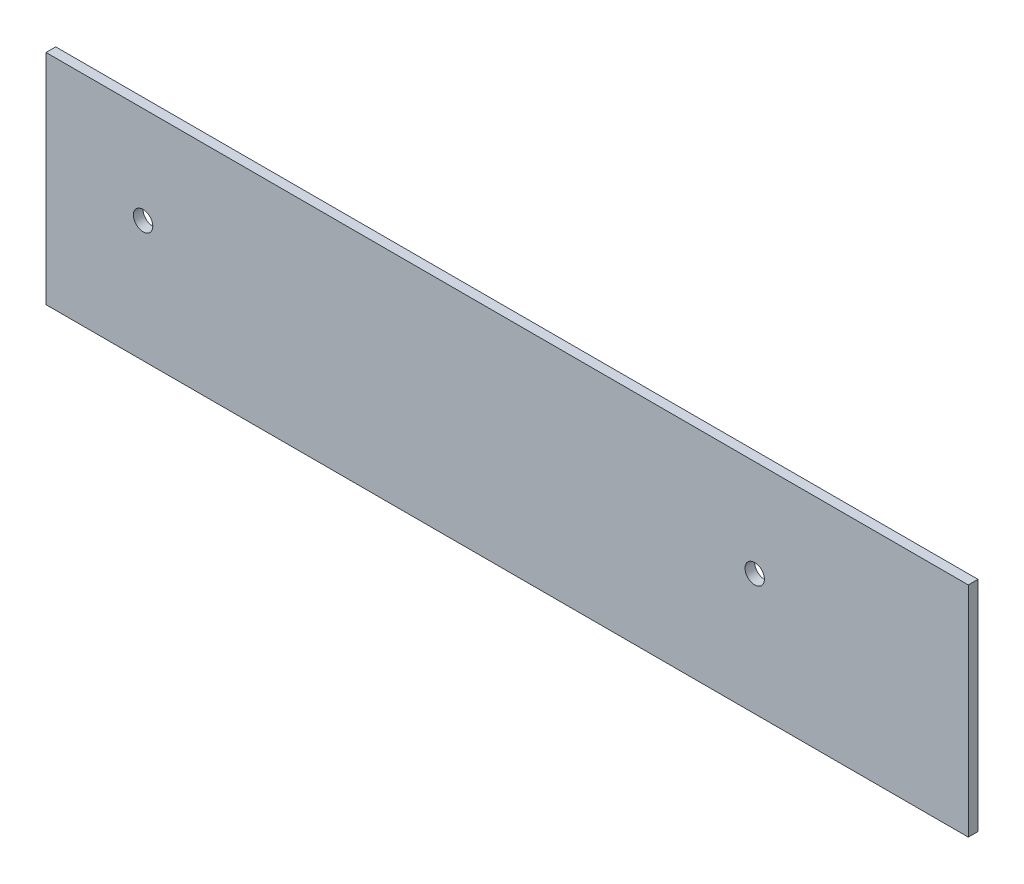
ISO-10303-21;
HEADER;
FILE_DESCRIPTION(('STEP AP214'),'2;1');
FILE_NAME('part.step','',(''),(''),'','','');
FILE_SCHEMA(('AUTOMOTIVE_DESIGN { 1 0 10303 214 1 1 1 1 }'));
ENDSEC;
DATA;
#1=APPLICATION_CONTEXT('core data for automotive mechanical design processes');
#2=APPLICATION_PROTOCOL_DEFINITION('international standard','automotive_design',2000,#1);
#3=PRODUCT_CONTEXT('',#1,'mechanical');
#4=PRODUCT('Part','Part','',(#3));
#5=PRODUCT_RELATED_PRODUCT_CATEGORY('part','',(#4));
#6=PRODUCT_DEFINITION_FORMATION('','',#4);
#7=PRODUCT_DEFINITION_CONTEXT('part definition',#1,'design');
#8=PRODUCT_DEFINITION('design','',#6,#7);
#9=PRODUCT_DEFINITION_SHAPE('','',#8);
#10=(LENGTH_UNIT() NAMED_UNIT(*) SI_UNIT(.MILLI.,.METRE.));
#11=(NAMED_UNIT(*) PLANE_ANGLE_UNIT() SI_UNIT($,.RADIAN.));
#12=(NAMED_UNIT(*) SI_UNIT($,.STERADIAN.) SOLID_ANGLE_UNIT());
#13=UNCERTAINTY_MEASURE_WITH_UNIT(LENGTH_MEASURE(1.E-05),#10,'distance_accuracy_value','');
#14=(GEOMETRIC_REPRESENTATION_CONTEXT(3) GLOBAL_UNCERTAINTY_ASSIGNED_CONTEXT((#13)) GLOBAL_UNIT_ASSIGNED_CONTEXT((#10,
#11,#12)) REPRESENTATION_CONTEXT('',''));
#15=CARTESIAN_POINT('',(0.,0.,0.));
#16=DIRECTION('',(0.,0.,1.));
#17=DIRECTION('',(1.,0.,0.));
#18=AXIS2_PLACEMENT_3D('',#15,#16,#17);
#19=CARTESIAN_POINT('',(95.,22.5,2.));
#20=DIRECTION('',(-1.,0.,0.));
#21=DIRECTION('',(0.,0.,1.));
#22=AXIS2_PLACEMENT_3D('',#19,#20,#21);
#23=PLANE('',#22);
#24=DIRECTION('',(0.,1.,0.));
#25=VECTOR('',#24,1.);
#26=CARTESIAN_POINT('',(95.,22.5,0.));
#27=LINE('',#26,#25);
#28=CARTESIAN_POINT('',(95.,-22.5,0.));
#29=VERTEX_POINT('',#28);
#30=CARTESIAN_POINT('',(95.,22.5,0.));
#31=VERTEX_POINT('',#30);
#32=EDGE_CURVE('E97',#29,#31,#27,.T.);
#33=ORIENTED_EDGE('',*,*,#32,.T.);
#34=DIRECTION('',(0.,0.,-1.));
#35=VECTOR('',#34,1.);
#36=CARTESIAN_POINT('',(95.,22.5,2.));
#37=LINE('',#36,#35);
#38=CARTESIAN_POINT('',(95.,22.5,2.));
#39=VERTEX_POINT('',#38);
#40=EDGE_CURVE('E11',#39,#31,#37,.T.);
#41=ORIENTED_EDGE('',*,*,#40,.F.);
#42=DIRECTION('',(0.,1.,0.));
#43=VECTOR('',#42,1.);
#44=CARTESIAN_POINT('',(95.,22.5,2.));
#45=LINE('',#44,#43);
#46=CARTESIAN_POINT('',(95.,-22.5,2.));
#47=VERTEX_POINT('',#46);
#48=EDGE_CURVE('E85',#47,#39,#45,.T.);
#49=ORIENTED_EDGE('',*,*,#48,.F.);
#50=DIRECTION('',(0.,0.,-1.));
#51=VECTOR('',#50,1.);
#52=CARTESIAN_POINT('',(95.,-22.5,2.));
#53=LINE('',#52,#51);
#54=EDGE_CURVE('E93',#47,#29,#53,.T.);
#55=ORIENTED_EDGE('',*,*,#54,.T.);
#56=EDGE_LOOP('',(#33,#41,#49,#55));
#57=FACE_BOUND('',#56,.T.);
#58=ADVANCED_FACE('F34',(#57),#23,.F.);
#59=CARTESIAN_POINT('',(-95.,22.5,2.));
#60=DIRECTION('',(0.,-1.,0.));
#61=DIRECTION('',(0.,0.,-1.));
#62=AXIS2_PLACEMENT_3D('',#59,#60,#61);
#63=PLANE('',#62);
#64=DIRECTION('',(-1.,0.,0.));
#65=VECTOR('',#64,1.);
#66=CARTESIAN_POINT('',(-95.,22.5,0.));
#67=LINE('',#66,#65);
#68=CARTESIAN_POINT('',(-95.,22.5,0.));
#69=VERTEX_POINT('',#68);
#70=EDGE_CURVE('E89',#31,#69,#67,.T.);
#71=ORIENTED_EDGE('',*,*,#70,.T.);
#72=DIRECTION('',(0.,0.,-1.));
#73=VECTOR('',#72,1.);
#74=CARTESIAN_POINT('',(-95.,22.5,2.));
#75=LINE('',#74,#73);
#76=CARTESIAN_POINT('',(-95.,22.5,2.));
#77=VERTEX_POINT('',#76);
#78=EDGE_CURVE('E42',#77,#69,#75,.T.);
#79=ORIENTED_EDGE('',*,*,#78,.F.);
#80=DIRECTION('',(-1.,0.,0.));
#81=VECTOR('',#80,1.);
#82=CARTESIAN_POINT('',(-95.,22.5,2.));
#83=LINE('',#82,#81);
#84=EDGE_CURVE('E80',#39,#77,#83,.T.);
#85=ORIENTED_EDGE('',*,*,#84,.F.);
#86=ORIENTED_EDGE('',*,*,#40,.T.);
#87=EDGE_LOOP('',(#71,#79,#85,#86));
#88=FACE_BOUND('',#87,.T.);
#89=ADVANCED_FACE('F88',(#88),#63,.F.);
#90=CARTESIAN_POINT('',(-95.,22.5,2.));
#91=DIRECTION('',(1.,0.,0.));
#92=DIRECTION('',(0.,0.,-1.));
#93=AXIS2_PLACEMENT_3D('',#90,#91,#92);
#94=PLANE('',#93);
#95=DIRECTION('',(0.,-1.,0.));
#96=VECTOR('',#95,1.);
#97=CARTESIAN_POINT('',(-95.,22.5,0.));
#98=LINE('',#97,#96);
#99=CARTESIAN_POINT('',(-95.,-22.5,0.));
#100=VERTEX_POINT('',#99);
#101=EDGE_CURVE('E67',#69,#100,#98,.T.);
#102=ORIENTED_EDGE('',*,*,#101,.T.);
#103=DIRECTION('',(0.,0.,-1.));
#104=VECTOR('',#103,1.);
#105=CARTESIAN_POINT('',(-95.,-22.5,2.));
#106=LINE('',#105,#104);
#107=CARTESIAN_POINT('',(-95.,-22.5,2.));
#108=VERTEX_POINT('',#107);
#109=EDGE_CURVE('E90',#108,#100,#106,.T.);
#110=ORIENTED_EDGE('',*,*,#109,.F.);
#111=DIRECTION('',(0.,-1.,0.));
#112=VECTOR('',#111,1.);
#113=CARTESIAN_POINT('',(-95.,22.5,2.));
#114=LINE('',#113,#112);
#115=EDGE_CURVE('E83',#77,#108,#114,.T.);
#116=ORIENTED_EDGE('',*,*,#115,.F.);
#117=ORIENTED_EDGE('',*,*,#78,.T.);
#118=EDGE_LOOP('',(#102,#110,#116,#117));
#119=FACE_BOUND('',#118,.T.);
#120=ADVANCED_FACE('F91',(#119),#94,.F.);
#121=CARTESIAN_POINT('',(-95.,-22.5,2.));
#122=DIRECTION('',(0.,1.,0.));
#123=DIRECTION('',(0.,0.,1.));
#124=AXIS2_PLACEMENT_3D('',#121,#122,#123);
#125=PLANE('',#124);
#126=DIRECTION('',(1.,0.,0.));
#127=VECTOR('',#126,1.);
#128=CARTESIAN_POINT('',(-95.,-22.5,0.));
#129=LINE('',#128,#127);
#130=EDGE_CURVE('E73',#100,#29,#129,.T.);
#131=ORIENTED_EDGE('',*,*,#130,.T.);
#132=ORIENTED_EDGE('',*,*,#54,.F.);
#133=DIRECTION('',(1.,0.,0.));
#134=VECTOR('',#133,1.);
#135=CARTESIAN_POINT('',(-95.,-22.5,2.));
#136=LINE('',#135,#134);
#137=EDGE_CURVE('E50',#108,#47,#136,.T.);
#138=ORIENTED_EDGE('',*,*,#137,.F.);
#139=ORIENTED_EDGE('',*,*,#109,.T.);
#140=EDGE_LOOP('',(#131,#132,#138,#139));
#141=FACE_BOUND('',#140,.T.);
#142=ADVANCED_FACE('F105',(#141),#125,.F.);
#143=CARTESIAN_POINT('',(0.,0.,2.));
#144=DIRECTION('',(0.,0.,1.));
#145=DIRECTION('',(1.,0.,0.));
#146=AXIS2_PLACEMENT_3D('',#143,#144,#145);
#147=PLANE('',#146);
#148=CARTESIAN_POINT('',(-75.,2.5,2.));
#149=DIRECTION('',(0.,0.,1.));
#150=DIRECTION('',(1.,0.,0.));
#151=AXIS2_PLACEMENT_3D('',#148,#149,#150);
#152=CIRCLE('',#151,2.);
#153=CARTESIAN_POINT('',(-73.,2.5,2.));
#154=VERTEX_POINT('',#153);
#155=EDGE_CURVE('E117',#154,#154,#152,.T.);
#156=ORIENTED_EDGE('',*,*,#155,.F.);
#157=EDGE_LOOP('',(#156));
#158=FACE_BOUND('',#157,.T.);
#159=CARTESIAN_POINT('',(51.,2.5,2.));
#160=DIRECTION('',(0.,0.,1.));
#161=DIRECTION('',(1.,0.,0.));
#162=AXIS2_PLACEMENT_3D('',#159,#160,#161);
#163=CIRCLE('',#162,2.);
#164=CARTESIAN_POINT('',(53.,2.5,2.));
#165=VERTEX_POINT('',#164);
#166=EDGE_CURVE('E111',#165,#165,#163,.T.);
#167=ORIENTED_EDGE('',*,*,#166,.F.);
#168=EDGE_LOOP('',(#167));
#169=FACE_BOUND('',#168,.T.);
#170=ORIENTED_EDGE('',*,*,#48,.T.);
#171=ORIENTED_EDGE('',*,*,#84,.T.);
#172=ORIENTED_EDGE('',*,*,#115,.T.);
#173=ORIENTED_EDGE('',*,*,#137,.T.);
#174=EDGE_LOOP('',(#170,#171,#172,#173));
#175=FACE_BOUND('',#174,.T.);
#176=ADVANCED_FACE('F81',(#158,#169,#175),#147,.T.);
#177=CARTESIAN_POINT('',(0.,0.,0.));
#178=DIRECTION('',(0.,0.,1.));
#179=DIRECTION('',(1.,0.,0.));
#180=AXIS2_PLACEMENT_3D('',#177,#178,#179);
#181=PLANE('',#180);
#182=CARTESIAN_POINT('',(-75.,2.5,0.));
#183=DIRECTION('',(0.,0.,1.));
#184=DIRECTION('',(1.,0.,0.));
#185=AXIS2_PLACEMENT_3D('',#182,#183,#184);
#186=CIRCLE('',#185,2.);
#187=CARTESIAN_POINT('',(-73.,2.5,0.));
#188=VERTEX_POINT('',#187);
#189=EDGE_CURVE('E100',#188,#188,#186,.T.);
#190=ORIENTED_EDGE('',*,*,#189,.T.);
#191=EDGE_LOOP('',(#190));
#192=FACE_BOUND('',#191,.T.);
#193=CARTESIAN_POINT('',(51.,2.5,0.));
#194=DIRECTION('',(0.,0.,1.));
#195=DIRECTION('',(1.,0.,0.));
#196=AXIS2_PLACEMENT_3D('',#193,#194,#195);
#197=CIRCLE('',#196,2.);
#198=CARTESIAN_POINT('',(53.,2.5,0.));
#199=VERTEX_POINT('',#198);
#200=EDGE_CURVE('E114',#199,#199,#197,.T.);
#201=ORIENTED_EDGE('',*,*,#200,.T.);
#202=EDGE_LOOP('',(#201));
#203=FACE_BOUND('',#202,.T.);
#204=ORIENTED_EDGE('',*,*,#32,.F.);
#205=ORIENTED_EDGE('',*,*,#130,.F.);
#206=ORIENTED_EDGE('',*,*,#101,.F.);
#207=ORIENTED_EDGE('',*,*,#70,.F.);
#208=EDGE_LOOP('',(#204,#205,#206,#207));
#209=FACE_BOUND('',#208,.T.);
#210=ADVANCED_FACE('F108',(#192,#203,#209),#181,.F.);
#211=CARTESIAN_POINT('',(51.,2.5,0.));
#212=DIRECTION('',(0.,0.,1.));
#213=DIRECTION('',(1.,0.,0.));
#214=AXIS2_PLACEMENT_3D('',#211,#212,#213);
#215=CYLINDRICAL_SURFACE('',#214,2.);
#216=ORIENTED_EDGE('',*,*,#200,.F.);
#217=EDGE_LOOP('',(#216));
#218=FACE_BOUND('',#217,.T.);
#219=ORIENTED_EDGE('',*,*,#166,.T.);
#220=EDGE_LOOP('',(#219));
#221=FACE_BOUND('',#220,.T.);
#222=ADVANCED_FACE('F128',(#218,#221),#215,.F.);
#223=CARTESIAN_POINT('',(-75.,2.5,0.));
#224=DIRECTION('',(0.,0.,1.));
#225=DIRECTION('',(1.,0.,0.));
#226=AXIS2_PLACEMENT_3D('',#223,#224,#225);
#227=CYLINDRICAL_SURFACE('',#226,2.);
#228=ORIENTED_EDGE('',*,*,#189,.F.);
#229=EDGE_LOOP('',(#228));
#230=FACE_BOUND('',#229,.T.);
#231=ORIENTED_EDGE('',*,*,#155,.T.);
#232=EDGE_LOOP('',(#231));
#233=FACE_BOUND('',#232,.T.);
#234=ADVANCED_FACE('F125',(#230,#233),#227,.F.);
#235=CLOSED_SHELL('',(#58,#89,#120,#142,#176,#210,#222,#234));
#236=MANIFOLD_SOLID_BREP('B2',#235);
#237=ADVANCED_BREP_SHAPE_REPRESENTATION('',(#18,#236),#14);
#238=SHAPE_DEFINITION_REPRESENTATION(#9,#237);
ENDSEC;
END-ISO-10303-21;
